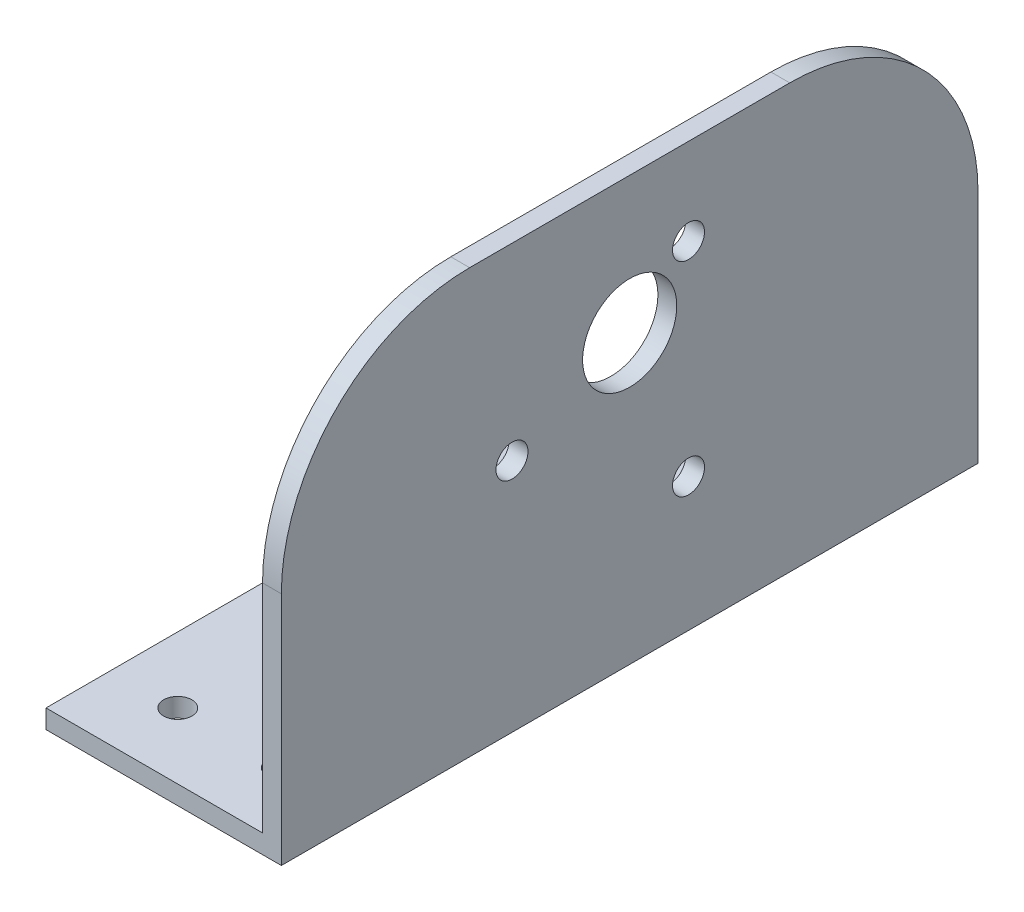
ISO-10303-21;
HEADER;
FILE_DESCRIPTION(('STEP AP214'),'2;1');
FILE_NAME('part.step','',(''),(''),'','','');
FILE_SCHEMA(('AUTOMOTIVE_DESIGN { 1 0 10303 214 1 1 1 1 }'));
ENDSEC;
DATA;
#1=APPLICATION_CONTEXT('core data for automotive mechanical design processes');
#2=APPLICATION_PROTOCOL_DEFINITION('international standard','automotive_design',2000,#1);
#3=PRODUCT_CONTEXT('',#1,'mechanical');
#4=PRODUCT('Part','Part','',(#3));
#5=PRODUCT_RELATED_PRODUCT_CATEGORY('part','',(#4));
#6=PRODUCT_DEFINITION_FORMATION('','',#4);
#7=PRODUCT_DEFINITION_CONTEXT('part definition',#1,'design');
#8=PRODUCT_DEFINITION('design','',#6,#7);
#9=PRODUCT_DEFINITION_SHAPE('','',#8);
#10=(LENGTH_UNIT() NAMED_UNIT(*) SI_UNIT(.MILLI.,.METRE.));
#11=(NAMED_UNIT(*) PLANE_ANGLE_UNIT() SI_UNIT($,.RADIAN.));
#12=(NAMED_UNIT(*) SI_UNIT($,.STERADIAN.) SOLID_ANGLE_UNIT());
#13=UNCERTAINTY_MEASURE_WITH_UNIT(LENGTH_MEASURE(1.E-05),#10,'distance_accuracy_value','');
#14=(GEOMETRIC_REPRESENTATION_CONTEXT(3) GLOBAL_UNCERTAINTY_ASSIGNED_CONTEXT((#13)) GLOBAL_UNIT_ASSIGNED_CONTEXT((#10,
#11,#12)) REPRESENTATION_CONTEXT('',''));
#15=CARTESIAN_POINT('',(0.,0.,0.));
#16=DIRECTION('',(0.,0.,1.));
#17=DIRECTION('',(1.,0.,0.));
#18=AXIS2_PLACEMENT_3D('',#15,#16,#17);
#19=CARTESIAN_POINT('',(0.,0.,74.));
#20=DIRECTION('',(0.,1.,0.));
#21=DIRECTION('',(0.,0.,1.));
#22=AXIS2_PLACEMENT_3D('',#19,#20,#21);
#23=PLANE('',#22);
#24=CARTESIAN_POINT('',(18.,0.,67.));
#25=DIRECTION('',(0.,1.,0.));
#26=DIRECTION('',(0.,0.,1.));
#27=AXIS2_PLACEMENT_3D('',#24,#25,#26);
#28=CIRCLE('',#27,1.5);
#29=CARTESIAN_POINT('',(18.,0.,68.5));
#30=VERTEX_POINT('',#29);
#31=EDGE_CURVE('E255',#30,#30,#28,.T.);
#32=ORIENTED_EDGE('',*,*,#31,.T.);
#33=EDGE_LOOP('',(#32));
#34=FACE_BOUND('',#33,.T.);
#35=CARTESIAN_POINT('',(18.,0.,7.00000000000001));
#36=DIRECTION('',(0.,-1.,0.));
#37=DIRECTION('',(0.,0.,-1.));
#38=AXIS2_PLACEMENT_3D('',#35,#36,#37);
#39=CIRCLE('',#38,1.5);
#40=CARTESIAN_POINT('',(18.,0.,5.50000000000001));
#41=VERTEX_POINT('',#40);
#42=EDGE_CURVE('E260',#41,#41,#39,.T.);
#43=ORIENTED_EDGE('',*,*,#42,.F.);
#44=EDGE_LOOP('',(#43));
#45=FACE_BOUND('',#44,.T.);
#46=CARTESIAN_POINT('',(7.,0.,7.00000000000001));
#47=DIRECTION('',(0.,-1.,0.));
#48=DIRECTION('',(0.,0.,-1.));
#49=AXIS2_PLACEMENT_3D('',#46,#47,#48);
#50=CIRCLE('',#49,1.5);
#51=CARTESIAN_POINT('',(7.,0.,5.50000000000001));
#52=VERTEX_POINT('',#51);
#53=EDGE_CURVE('E242',#52,#52,#50,.T.);
#54=ORIENTED_EDGE('',*,*,#53,.F.);
#55=EDGE_LOOP('',(#54));
#56=FACE_BOUND('',#55,.T.);
#57=DIRECTION('',(1.,0.,0.));
#58=VECTOR('',#57,1.);
#59=CARTESIAN_POINT('',(0.,0.,0.));
#60=LINE('',#59,#58);
#61=CARTESIAN_POINT('',(0.,0.,0.));
#62=VERTEX_POINT('',#61);
#63=CARTESIAN_POINT('',(25.,0.,0.));
#64=VERTEX_POINT('',#63);
#65=EDGE_CURVE('E180',#62,#64,#60,.T.);
#66=ORIENTED_EDGE('',*,*,#65,.T.);
#67=DIRECTION('',(0.,0.,-1.));
#68=VECTOR('',#67,1.);
#69=CARTESIAN_POINT('',(25.,0.,74.));
#70=LINE('',#69,#68);
#71=CARTESIAN_POINT('',(25.,0.,74.));
#72=VERTEX_POINT('',#71);
#73=EDGE_CURVE('E110',#72,#64,#70,.T.);
#74=ORIENTED_EDGE('',*,*,#73,.F.);
#75=DIRECTION('',(1.,0.,0.));
#76=VECTOR('',#75,1.);
#77=CARTESIAN_POINT('',(0.,0.,74.));
#78=LINE('',#77,#76);
#79=CARTESIAN_POINT('',(0.,0.,74.));
#80=VERTEX_POINT('',#79);
#81=EDGE_CURVE('E103',#80,#72,#78,.T.);
#82=ORIENTED_EDGE('',*,*,#81,.F.);
#83=DIRECTION('',(0.,0.,-1.));
#84=VECTOR('',#83,1.);
#85=CARTESIAN_POINT('',(0.,0.,74.));
#86=LINE('',#85,#84);
#87=EDGE_CURVE('E107',#80,#62,#86,.T.);
#88=ORIENTED_EDGE('',*,*,#87,.T.);
#89=EDGE_LOOP('',(#66,#74,#82,#88));
#90=FACE_BOUND('',#89,.T.);
#91=CARTESIAN_POINT('',(7.,0.,67.));
#92=DIRECTION('',(0.,1.,0.));
#93=DIRECTION('',(0.,0.,1.));
#94=AXIS2_PLACEMENT_3D('',#91,#92,#93);
#95=CIRCLE('',#94,1.5);
#96=CARTESIAN_POINT('',(7.,0.,68.5));
#97=VERTEX_POINT('',#96);
#98=EDGE_CURVE('E249',#97,#97,#95,.T.);
#99=ORIENTED_EDGE('',*,*,#98,.T.);
#100=EDGE_LOOP('',(#99));
#101=FACE_BOUND('',#100,.T.);
#102=ADVANCED_FACE('F34',(#34,#45,#56,#90,#101),#23,.F.);
#103=CARTESIAN_POINT('',(23.,2.,74.));
#104=DIRECTION('',(0.,-1.,0.));
#105=DIRECTION('',(0.,0.,-1.));
#106=AXIS2_PLACEMENT_3D('',#103,#104,#105);
#107=PLANE('',#106);
#108=CARTESIAN_POINT('',(18.,2.,67.));
#109=DIRECTION('',(0.,1.,0.));
#110=DIRECTION('',(0.,0.,1.));
#111=AXIS2_PLACEMENT_3D('',#108,#109,#110);
#112=CIRCLE('',#111,1.5);
#113=CARTESIAN_POINT('',(18.,2.,68.5));
#114=VERTEX_POINT('',#113);
#115=EDGE_CURVE('E257',#114,#114,#112,.T.);
#116=ORIENTED_EDGE('',*,*,#115,.F.);
#117=EDGE_LOOP('',(#116));
#118=FACE_BOUND('',#117,.T.);
#119=CARTESIAN_POINT('',(18.,2.,7.00000000000001));
#120=DIRECTION('',(0.,-1.,0.));
#121=DIRECTION('',(0.,0.,-1.));
#122=AXIS2_PLACEMENT_3D('',#119,#120,#121);
#123=CIRCLE('',#122,1.5);
#124=CARTESIAN_POINT('',(18.,2.,5.50000000000001));
#125=VERTEX_POINT('',#124);
#126=EDGE_CURVE('E246',#125,#125,#123,.T.);
#127=ORIENTED_EDGE('',*,*,#126,.T.);
#128=EDGE_LOOP('',(#127));
#129=FACE_BOUND('',#128,.T.);
#130=CARTESIAN_POINT('',(7.,2.,7.00000000000001));
#131=DIRECTION('',(0.,-1.,0.));
#132=DIRECTION('',(0.,0.,-1.));
#133=AXIS2_PLACEMENT_3D('',#130,#131,#132);
#134=CIRCLE('',#133,1.5);
#135=CARTESIAN_POINT('',(7.,2.,5.50000000000001));
#136=VERTEX_POINT('',#135);
#137=EDGE_CURVE('E243',#136,#136,#134,.T.);
#138=ORIENTED_EDGE('',*,*,#137,.T.);
#139=EDGE_LOOP('',(#138));
#140=FACE_BOUND('',#139,.T.);
#141=DIRECTION('',(-1.,0.,0.));
#142=VECTOR('',#141,1.);
#143=CARTESIAN_POINT('',(23.,2.,0.));
#144=LINE('',#143,#142);
#145=CARTESIAN_POINT('',(23.,2.,0.));
#146=VERTEX_POINT('',#145);
#147=CARTESIAN_POINT('',(0.,2.,0.));
#148=VERTEX_POINT('',#147);
#149=EDGE_CURVE('E122',#146,#148,#144,.T.);
#150=ORIENTED_EDGE('',*,*,#149,.T.);
#151=DIRECTION('',(0.,0.,-1.));
#152=VECTOR('',#151,1.);
#153=CARTESIAN_POINT('',(0.,2.,74.));
#154=LINE('',#153,#152);
#155=CARTESIAN_POINT('',(0.,2.,74.));
#156=VERTEX_POINT('',#155);
#157=EDGE_CURVE('E184',#156,#148,#154,.T.);
#158=ORIENTED_EDGE('',*,*,#157,.F.);
#159=DIRECTION('',(-1.,0.,0.));
#160=VECTOR('',#159,1.);
#161=CARTESIAN_POINT('',(23.,2.,74.));
#162=LINE('',#161,#160);
#163=CARTESIAN_POINT('',(23.,2.,74.));
#164=VERTEX_POINT('',#163);
#165=EDGE_CURVE('E118',#164,#156,#162,.T.);
#166=ORIENTED_EDGE('',*,*,#165,.F.);
#167=DIRECTION('',(0.,0.,-1.));
#168=VECTOR('',#167,1.);
#169=CARTESIAN_POINT('',(23.,2.,74.));
#170=LINE('',#169,#168);
#171=EDGE_CURVE('E186',#164,#146,#170,.T.);
#172=ORIENTED_EDGE('',*,*,#171,.T.);
#173=EDGE_LOOP('',(#150,#158,#166,#172));
#174=FACE_BOUND('',#173,.T.);
#175=CARTESIAN_POINT('',(7.,2.,67.));
#176=DIRECTION('',(0.,1.,0.));
#177=DIRECTION('',(0.,0.,1.));
#178=AXIS2_PLACEMENT_3D('',#175,#176,#177);
#179=CIRCLE('',#178,1.5);
#180=CARTESIAN_POINT('',(7.,2.,68.5));
#181=VERTEX_POINT('',#180);
#182=EDGE_CURVE('E252',#181,#181,#179,.T.);
#183=ORIENTED_EDGE('',*,*,#182,.F.);
#184=EDGE_LOOP('',(#183));
#185=FACE_BOUND('',#184,.T.);
#186=ADVANCED_FACE('F189',(#118,#129,#140,#174,#185),#107,.F.);
#187=CARTESIAN_POINT('',(0.,2.,74.));
#188=DIRECTION('',(1.,0.,0.));
#189=DIRECTION('',(0.,0.,-1.));
#190=AXIS2_PLACEMENT_3D('',#187,#188,#189);
#191=PLANE('',#190);
#192=DIRECTION('',(0.,-1.,0.));
#193=VECTOR('',#192,1.);
#194=CARTESIAN_POINT('',(0.,2.,0.));
#195=LINE('',#194,#193);
#196=EDGE_CURVE('E126',#148,#62,#195,.T.);
#197=ORIENTED_EDGE('',*,*,#196,.T.);
#198=ORIENTED_EDGE('',*,*,#87,.F.);
#199=DIRECTION('',(0.,-1.,0.));
#200=VECTOR('',#199,1.);
#201=CARTESIAN_POINT('',(0.,2.,74.));
#202=LINE('',#201,#200);
#203=EDGE_CURVE('E113',#156,#80,#202,.T.);
#204=ORIENTED_EDGE('',*,*,#203,.F.);
#205=ORIENTED_EDGE('',*,*,#157,.T.);
#206=EDGE_LOOP('',(#197,#198,#204,#205));
#207=FACE_BOUND('',#206,.T.);
#208=ADVANCED_FACE('F124',(#207),#191,.F.);
#209=CARTESIAN_POINT('',(25.,0.,74.));
#210=DIRECTION('',(-1.,0.,0.));
#211=DIRECTION('',(0.,0.,1.));
#212=AXIS2_PLACEMENT_3D('',#209,#210,#211);
#213=PLANE('',#212);
#214=CARTESIAN_POINT('',(25.,14.1746824526945,30.75));
#215=DIRECTION('',(1.,0.,0.));
#216=DIRECTION('',(0.,0.,-1.));
#217=AXIS2_PLACEMENT_3D('',#214,#215,#216);
#218=CIRCLE('',#217,1.69999999999999);
#219=CARTESIAN_POINT('',(25.,14.1746824526945,29.05));
#220=VERTEX_POINT('',#219);
#221=EDGE_CURVE('E149',#220,#220,#218,.T.);
#222=ORIENTED_EDGE('',*,*,#221,.F.);
#223=EDGE_LOOP('',(#222));
#224=FACE_BOUND('',#223,.T.);
#225=CARTESIAN_POINT('',(25.,35.8253175473055,30.75));
#226=DIRECTION('',(1.,0.,0.));
#227=DIRECTION('',(0.,0.,-1.));
#228=AXIS2_PLACEMENT_3D('',#225,#226,#227);
#229=CIRCLE('',#228,1.69999999999999);
#230=CARTESIAN_POINT('',(25.,35.8253175473055,29.05));
#231=VERTEX_POINT('',#230);
#232=EDGE_CURVE('E146',#231,#231,#229,.T.);
#233=ORIENTED_EDGE('',*,*,#232,.F.);
#234=EDGE_LOOP('',(#233));
#235=FACE_BOUND('',#234,.T.);
#236=CARTESIAN_POINT('',(25.,25.,49.5));
#237=DIRECTION('',(1.,0.,0.));
#238=DIRECTION('',(0.,0.,-1.));
#239=AXIS2_PLACEMENT_3D('',#236,#237,#238);
#240=CIRCLE('',#239,1.69999999999999);
#241=CARTESIAN_POINT('',(25.,25.,47.8));
#242=VERTEX_POINT('',#241);
#243=EDGE_CURVE('E142',#242,#242,#240,.T.);
#244=ORIENTED_EDGE('',*,*,#243,.F.);
#245=EDGE_LOOP('',(#244));
#246=FACE_BOUND('',#245,.T.);
#247=CARTESIAN_POINT('',(25.,30.5,37.));
#248=DIRECTION('',(1.,0.,0.));
#249=DIRECTION('',(0.,0.,-1.));
#250=AXIS2_PLACEMENT_3D('',#247,#248,#249);
#251=CIRCLE('',#250,5.);
#252=CARTESIAN_POINT('',(25.,30.5,32.));
#253=VERTEX_POINT('',#252);
#254=EDGE_CURVE('E138',#253,#253,#251,.T.);
#255=ORIENTED_EDGE('',*,*,#254,.F.);
#256=EDGE_LOOP('',(#255));
#257=FACE_BOUND('',#256,.T.);
#258=DIRECTION('',(0.,1.,0.));
#259=VECTOR('',#258,1.);
#260=CARTESIAN_POINT('',(25.,0.,0.));
#261=LINE('',#260,#259);
#262=CARTESIAN_POINT('',(25.,25.,0.));
#263=VERTEX_POINT('',#262);
#264=EDGE_CURVE('E161',#64,#263,#261,.T.);
#265=ORIENTED_EDGE('',*,*,#264,.T.);
#266=CARTESIAN_POINT('',(25.,25.,20.));
#267=DIRECTION('',(-1.,0.,0.));
#268=DIRECTION('',(0.,0.,1.));
#269=AXIS2_PLACEMENT_3D('',#266,#267,#268);
#270=CIRCLE('',#269,20.);
#271=CARTESIAN_POINT('',(25.,45.,20.));
#272=VERTEX_POINT('',#271);
#273=EDGE_CURVE('E42',#263,#272,#270,.F.);
#274=ORIENTED_EDGE('',*,*,#273,.T.);
#275=DIRECTION('',(0.,0.,-1.));
#276=VECTOR('',#275,1.);
#277=CARTESIAN_POINT('',(25.,45.,74.));
#278=LINE('',#277,#276);
#279=CARTESIAN_POINT('',(25.,45.,54.));
#280=VERTEX_POINT('',#279);
#281=EDGE_CURVE('E131',#280,#272,#278,.T.);
#282=ORIENTED_EDGE('',*,*,#281,.F.);
#283=CARTESIAN_POINT('',(25.,25.,54.));
#284=DIRECTION('',(-1.,0.,0.));
#285=DIRECTION('',(0.,0.,1.));
#286=AXIS2_PLACEMENT_3D('',#283,#284,#285);
#287=CIRCLE('',#286,20.);
#288=CARTESIAN_POINT('',(25.,25.,74.));
#289=VERTEX_POINT('',#288);
#290=EDGE_CURVE('E49',#280,#289,#287,.F.);
#291=ORIENTED_EDGE('',*,*,#290,.T.);
#292=DIRECTION('',(0.,1.,0.));
#293=VECTOR('',#292,1.);
#294=CARTESIAN_POINT('',(25.,0.,74.));
#295=LINE('',#294,#293);
#296=EDGE_CURVE('E112',#72,#289,#295,.T.);
#297=ORIENTED_EDGE('',*,*,#296,.F.);
#298=ORIENTED_EDGE('',*,*,#73,.T.);
#299=EDGE_LOOP('',(#265,#274,#282,#291,#297,#298));
#300=FACE_BOUND('',#299,.T.);
#301=ADVANCED_FACE('F160',(#224,#235,#246,#257,#300),#213,.F.);
#302=CARTESIAN_POINT('',(25.,45.,74.));
#303=DIRECTION('',(0.,-1.,0.));
#304=DIRECTION('',(0.,0.,-1.));
#305=AXIS2_PLACEMENT_3D('',#302,#303,#304);
#306=PLANE('',#305);
#307=ORIENTED_EDGE('',*,*,#281,.T.);
#308=DIRECTION('',(-1.,0.,0.));
#309=VECTOR('',#308,1.);
#310=CARTESIAN_POINT('',(25.,45.,20.));
#311=LINE('',#310,#309);
#312=CARTESIAN_POINT('',(23.,45.,20.));
#313=VERTEX_POINT('',#312);
#314=EDGE_CURVE('E129',#272,#313,#311,.T.);
#315=ORIENTED_EDGE('',*,*,#314,.T.);
#316=DIRECTION('',(0.,0.,-1.));
#317=VECTOR('',#316,1.);
#318=CARTESIAN_POINT('',(23.,45.,74.));
#319=LINE('',#318,#317);
#320=CARTESIAN_POINT('',(23.,45.,54.));
#321=VERTEX_POINT('',#320);
#322=EDGE_CURVE('E169',#321,#313,#319,.T.);
#323=ORIENTED_EDGE('',*,*,#322,.F.);
#324=DIRECTION('',(-1.,0.,0.));
#325=VECTOR('',#324,1.);
#326=CARTESIAN_POINT('',(25.,45.,54.));
#327=LINE('',#326,#325);
#328=EDGE_CURVE('E127',#321,#280,#327,.F.);
#329=ORIENTED_EDGE('',*,*,#328,.T.);
#330=EDGE_LOOP('',(#307,#315,#323,#329));
#331=FACE_BOUND('',#330,.T.);
#332=ADVANCED_FACE('F165',(#331),#306,.F.);
#333=CARTESIAN_POINT('',(23.,45.,74.));
#334=DIRECTION('',(1.,0.,0.));
#335=DIRECTION('',(0.,1.,0.));
#336=AXIS2_PLACEMENT_3D('',#333,#334,#335);
#337=PLANE('',#336);
#338=CARTESIAN_POINT('',(23.,14.1746824526945,30.75));
#339=DIRECTION('',(1.,0.,0.));
#340=DIRECTION('',(0.,1.,0.));
#341=AXIS2_PLACEMENT_3D('',#338,#339,#340);
#342=CIRCLE('',#341,1.69999999999999);
#343=CARTESIAN_POINT('',(23.,15.8746824526945,30.75));
#344=VERTEX_POINT('',#343);
#345=EDGE_CURVE('E147',#344,#344,#342,.T.);
#346=ORIENTED_EDGE('',*,*,#345,.T.);
#347=EDGE_LOOP('',(#346));
#348=FACE_BOUND('',#347,.T.);
#349=CARTESIAN_POINT('',(23.,35.8253175473055,30.75));
#350=DIRECTION('',(1.,0.,0.));
#351=DIRECTION('',(0.,1.,0.));
#352=AXIS2_PLACEMENT_3D('',#349,#350,#351);
#353=CIRCLE('',#352,1.69999999999999);
#354=CARTESIAN_POINT('',(23.,37.5253175473055,30.75));
#355=VERTEX_POINT('',#354);
#356=EDGE_CURVE('E143',#355,#355,#353,.T.);
#357=ORIENTED_EDGE('',*,*,#356,.T.);
#358=EDGE_LOOP('',(#357));
#359=FACE_BOUND('',#358,.T.);
#360=CARTESIAN_POINT('',(23.,25.,49.5));
#361=DIRECTION('',(1.,0.,0.));
#362=DIRECTION('',(0.,1.,0.));
#363=AXIS2_PLACEMENT_3D('',#360,#361,#362);
#364=CIRCLE('',#363,1.69999999999999);
#365=CARTESIAN_POINT('',(23.,26.7,49.5));
#366=VERTEX_POINT('',#365);
#367=EDGE_CURVE('E139',#366,#366,#364,.T.);
#368=ORIENTED_EDGE('',*,*,#367,.T.);
#369=EDGE_LOOP('',(#368));
#370=FACE_BOUND('',#369,.T.);
#371=CARTESIAN_POINT('',(23.,30.5,37.));
#372=DIRECTION('',(1.,0.,0.));
#373=DIRECTION('',(0.,1.,0.));
#374=AXIS2_PLACEMENT_3D('',#371,#372,#373);
#375=CIRCLE('',#374,5.);
#376=CARTESIAN_POINT('',(23.,35.5,37.));
#377=VERTEX_POINT('',#376);
#378=EDGE_CURVE('E135',#377,#377,#375,.T.);
#379=ORIENTED_EDGE('',*,*,#378,.T.);
#380=EDGE_LOOP('',(#379));
#381=FACE_BOUND('',#380,.T.);
#382=ORIENTED_EDGE('',*,*,#322,.T.);
#383=CARTESIAN_POINT('',(23.,25.,20.));
#384=DIRECTION('',(1.,0.,0.));
#385=DIRECTION('',(0.,1.,0.));
#386=AXIS2_PLACEMENT_3D('',#383,#384,#385);
#387=CIRCLE('',#386,20.);
#388=CARTESIAN_POINT('',(23.,25.,0.));
#389=VERTEX_POINT('',#388);
#390=EDGE_CURVE('E155',#313,#389,#387,.F.);
#391=ORIENTED_EDGE('',*,*,#390,.T.);
#392=DIRECTION('',(0.,-1.,0.));
#393=VECTOR('',#392,1.);
#394=CARTESIAN_POINT('',(23.,45.,0.));
#395=LINE('',#394,#393);
#396=EDGE_CURVE('E174',#389,#146,#395,.T.);
#397=ORIENTED_EDGE('',*,*,#396,.T.);
#398=ORIENTED_EDGE('',*,*,#171,.F.);
#399=DIRECTION('',(0.,-1.,0.));
#400=VECTOR('',#399,1.);
#401=CARTESIAN_POINT('',(23.,45.,74.));
#402=LINE('',#401,#400);
#403=CARTESIAN_POINT('',(23.,25.,74.));
#404=VERTEX_POINT('',#403);
#405=EDGE_CURVE('E192',#404,#164,#402,.T.);
#406=ORIENTED_EDGE('',*,*,#405,.F.);
#407=CARTESIAN_POINT('',(23.,25.,54.));
#408=DIRECTION('',(1.,0.,0.));
#409=DIRECTION('',(0.,1.,0.));
#410=AXIS2_PLACEMENT_3D('',#407,#408,#409);
#411=CIRCLE('',#410,20.);
#412=EDGE_CURVE('E153',#404,#321,#411,.F.);
#413=ORIENTED_EDGE('',*,*,#412,.T.);
#414=EDGE_LOOP('',(#382,#391,#397,#398,#406,#413));
#415=FACE_BOUND('',#414,.T.);
#416=ADVANCED_FACE('F172',(#348,#359,#370,#381,#415),#337,.F.);
#417=CARTESIAN_POINT('',(0.,0.,74.));
#418=DIRECTION('',(0.,0.,1.));
#419=DIRECTION('',(1.,0.,0.));
#420=AXIS2_PLACEMENT_3D('',#417,#418,#419);
#421=PLANE('',#420);
#422=ORIENTED_EDGE('',*,*,#296,.T.);
#423=DIRECTION('',(-1.,0.,0.));
#424=VECTOR('',#423,1.);
#425=CARTESIAN_POINT('',(23.,25.,74.));
#426=LINE('',#425,#424);
#427=EDGE_CURVE('E11',#289,#404,#426,.T.);
#428=ORIENTED_EDGE('',*,*,#427,.T.);
#429=ORIENTED_EDGE('',*,*,#405,.T.);
#430=ORIENTED_EDGE('',*,*,#165,.T.);
#431=ORIENTED_EDGE('',*,*,#203,.T.);
#432=ORIENTED_EDGE('',*,*,#81,.T.);
#433=EDGE_LOOP('',(#422,#428,#429,#430,#431,#432));
#434=FACE_BOUND('',#433,.T.);
#435=ADVANCED_FACE('F116',(#434),#421,.T.);
#436=CARTESIAN_POINT('',(0.,0.,0.));
#437=DIRECTION('',(0.,0.,1.));
#438=DIRECTION('',(1.,0.,0.));
#439=AXIS2_PLACEMENT_3D('',#436,#437,#438);
#440=PLANE('',#439);
#441=ORIENTED_EDGE('',*,*,#396,.F.);
#442=DIRECTION('',(-1.,0.,0.));
#443=VECTOR('',#442,1.);
#444=CARTESIAN_POINT('',(0.,25.,0.));
#445=LINE('',#444,#443);
#446=EDGE_CURVE('E57',#389,#263,#445,.F.);
#447=ORIENTED_EDGE('',*,*,#446,.T.);
#448=ORIENTED_EDGE('',*,*,#264,.F.);
#449=ORIENTED_EDGE('',*,*,#65,.F.);
#450=ORIENTED_EDGE('',*,*,#196,.F.);
#451=ORIENTED_EDGE('',*,*,#149,.F.);
#452=EDGE_LOOP('',(#441,#447,#448,#449,#450,#451));
#453=FACE_BOUND('',#452,.T.);
#454=ADVANCED_FACE('F177',(#453),#440,.F.);
#455=CARTESIAN_POINT('',(0.,30.5,37.));
#456=DIRECTION('',(1.,0.,0.));
#457=DIRECTION('',(0.,0.,-1.));
#458=AXIS2_PLACEMENT_3D('',#455,#456,#457);
#459=CYLINDRICAL_SURFACE('',#458,5.);
#460=ORIENTED_EDGE('',*,*,#254,.T.);
#461=EDGE_LOOP('',(#460));
#462=FACE_BOUND('',#461,.T.);
#463=ORIENTED_EDGE('',*,*,#378,.F.);
#464=EDGE_LOOP('',(#463));
#465=FACE_BOUND('',#464,.T.);
#466=ADVANCED_FACE('F297',(#462,#465),#459,.F.);
#467=CARTESIAN_POINT('',(25.,25.,49.5));
#468=DIRECTION('',(1.,0.,0.));
#469=DIRECTION('',(0.,0.,-1.));
#470=AXIS2_PLACEMENT_3D('',#467,#468,#469);
#471=CYLINDRICAL_SURFACE('',#470,1.69999999999999);
#472=ORIENTED_EDGE('',*,*,#243,.T.);
#473=EDGE_LOOP('',(#472));
#474=FACE_BOUND('',#473,.T.);
#475=ORIENTED_EDGE('',*,*,#367,.F.);
#476=EDGE_LOOP('',(#475));
#477=FACE_BOUND('',#476,.T.);
#478=ADVANCED_FACE('F293',(#474,#477),#471,.F.);
#479=CARTESIAN_POINT('',(25.,35.8253175473055,30.75));
#480=DIRECTION('',(1.,0.,0.));
#481=DIRECTION('',(0.,0.,-1.));
#482=AXIS2_PLACEMENT_3D('',#479,#480,#481);
#483=CYLINDRICAL_SURFACE('',#482,1.69999999999999);
#484=ORIENTED_EDGE('',*,*,#232,.T.);
#485=EDGE_LOOP('',(#484));
#486=FACE_BOUND('',#485,.T.);
#487=ORIENTED_EDGE('',*,*,#356,.F.);
#488=EDGE_LOOP('',(#487));
#489=FACE_BOUND('',#488,.T.);
#490=ADVANCED_FACE('F289',(#486,#489),#483,.F.);
#491=CARTESIAN_POINT('',(25.,14.1746824526945,30.75));
#492=DIRECTION('',(1.,0.,0.));
#493=DIRECTION('',(0.,0.,-1.));
#494=AXIS2_PLACEMENT_3D('',#491,#492,#493);
#495=CYLINDRICAL_SURFACE('',#494,1.69999999999999);
#496=ORIENTED_EDGE('',*,*,#221,.T.);
#497=EDGE_LOOP('',(#496));
#498=FACE_BOUND('',#497,.T.);
#499=ORIENTED_EDGE('',*,*,#345,.F.);
#500=EDGE_LOOP('',(#499));
#501=FACE_BOUND('',#500,.T.);
#502=ADVANCED_FACE('F280',(#498,#501),#495,.F.);
#503=CARTESIAN_POINT('',(7.,0.,7.00000000000001));
#504=DIRECTION('',(0.,1.,0.));
#505=DIRECTION('',(0.,0.,1.));
#506=AXIS2_PLACEMENT_3D('',#503,#504,#505);
#507=CYLINDRICAL_SURFACE('',#506,1.5);
#508=ORIENTED_EDGE('',*,*,#53,.T.);
#509=EDGE_LOOP('',(#508));
#510=FACE_BOUND('',#509,.T.);
#511=ORIENTED_EDGE('',*,*,#137,.F.);
#512=EDGE_LOOP('',(#511));
#513=FACE_BOUND('',#512,.T.);
#514=ADVANCED_FACE('F271',(#510,#513),#507,.F.);
#515=CARTESIAN_POINT('',(18.,0.,7.00000000000001));
#516=DIRECTION('',(0.,1.,0.));
#517=DIRECTION('',(0.,0.,1.));
#518=AXIS2_PLACEMENT_3D('',#515,#516,#517);
#519=CYLINDRICAL_SURFACE('',#518,1.5);
#520=ORIENTED_EDGE('',*,*,#42,.T.);
#521=EDGE_LOOP('',(#520));
#522=FACE_BOUND('',#521,.T.);
#523=ORIENTED_EDGE('',*,*,#126,.F.);
#524=EDGE_LOOP('',(#523));
#525=FACE_BOUND('',#524,.T.);
#526=ADVANCED_FACE('F268',(#522,#525),#519,.F.);
#527=CARTESIAN_POINT('',(18.,0.,67.));
#528=DIRECTION('',(0.,1.,0.));
#529=DIRECTION('',(0.,0.,1.));
#530=AXIS2_PLACEMENT_3D('',#527,#528,#529);
#531=CYLINDRICAL_SURFACE('',#530,1.5);
#532=ORIENTED_EDGE('',*,*,#31,.F.);
#533=EDGE_LOOP('',(#532));
#534=FACE_BOUND('',#533,.T.);
#535=ORIENTED_EDGE('',*,*,#115,.T.);
#536=EDGE_LOOP('',(#535));
#537=FACE_BOUND('',#536,.T.);
#538=ADVANCED_FACE('F270',(#534,#537),#531,.F.);
#539=CARTESIAN_POINT('',(7.,0.,67.));
#540=DIRECTION('',(0.,1.,0.));
#541=DIRECTION('',(0.,0.,1.));
#542=AXIS2_PLACEMENT_3D('',#539,#540,#541);
#543=CYLINDRICAL_SURFACE('',#542,1.5);
#544=ORIENTED_EDGE('',*,*,#98,.F.);
#545=EDGE_LOOP('',(#544));
#546=FACE_BOUND('',#545,.T.);
#547=ORIENTED_EDGE('',*,*,#182,.T.);
#548=EDGE_LOOP('',(#547));
#549=FACE_BOUND('',#548,.T.);
#550=ADVANCED_FACE('F203',(#546,#549),#543,.F.);
#551=CARTESIAN_POINT('',(25.,25.,20.));
#552=DIRECTION('',(-1.,0.,0.));
#553=DIRECTION('',(0.,0.,1.));
#554=AXIS2_PLACEMENT_3D('',#551,#552,#553);
#555=CYLINDRICAL_SURFACE('',#554,20.);
#556=ORIENTED_EDGE('',*,*,#273,.F.);
#557=ORIENTED_EDGE('',*,*,#446,.F.);
#558=ORIENTED_EDGE('',*,*,#390,.F.);
#559=ORIENTED_EDGE('',*,*,#314,.F.);
#560=EDGE_LOOP('',(#556,#557,#558,#559));
#561=FACE_BOUND('',#560,.T.);
#562=ADVANCED_FACE('F170',(#561),#555,.T.);
#563=CARTESIAN_POINT('',(0.,25.,54.));
#564=DIRECTION('',(1.,0.,0.));
#565=DIRECTION('',(0.,0.,-1.));
#566=AXIS2_PLACEMENT_3D('',#563,#564,#565);
#567=CYLINDRICAL_SURFACE('',#566,20.);
#568=ORIENTED_EDGE('',*,*,#290,.F.);
#569=ORIENTED_EDGE('',*,*,#328,.F.);
#570=ORIENTED_EDGE('',*,*,#412,.F.);
#571=ORIENTED_EDGE('',*,*,#427,.F.);
#572=EDGE_LOOP('',(#568,#569,#570,#571));
#573=FACE_BOUND('',#572,.T.);
#574=ADVANCED_FACE('F36',(#573),#567,.T.);
#575=CLOSED_SHELL('',(#102,#186,#208,#301,#332,#416,#435,#454,#466,#478,#490,#502,#514,#526,
#538,#550,#562,#574));
#576=MANIFOLD_SOLID_BREP('B2',#575);
#577=ADVANCED_BREP_SHAPE_REPRESENTATION('',(#18,#576),#14);
#578=SHAPE_DEFINITION_REPRESENTATION(#9,#577);
ENDSEC;
END-ISO-10303-21;
